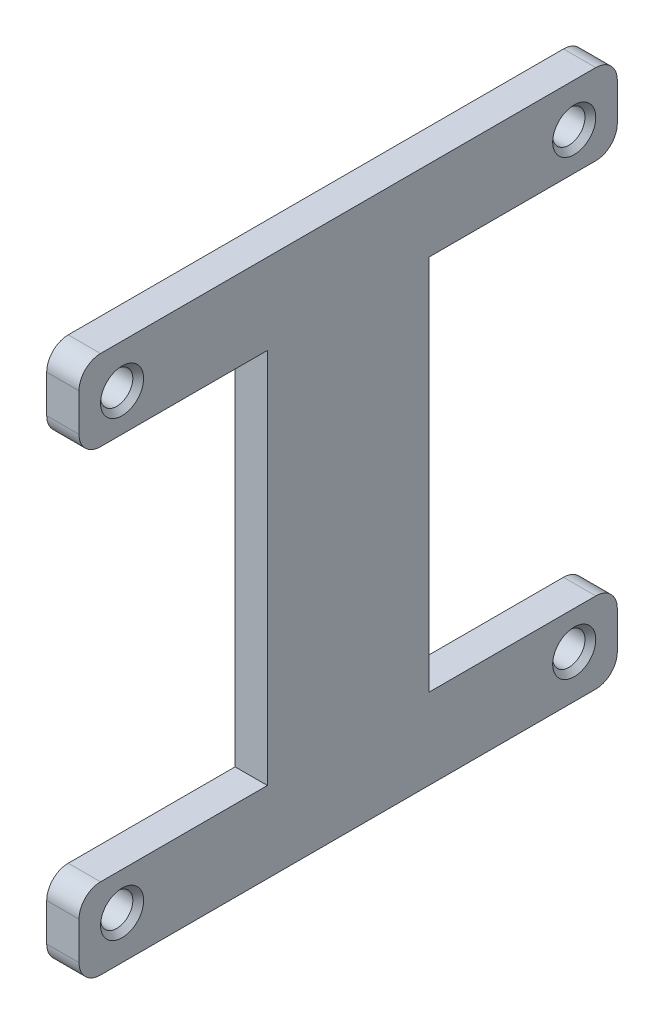
ISO-10303-21;
HEADER;
FILE_DESCRIPTION(('STEP AP214'),'2;1');
FILE_NAME('part.step','',(''),(''),'','','');
FILE_SCHEMA(('AUTOMOTIVE_DESIGN { 1 0 10303 214 1 1 1 1 }'));
ENDSEC;
DATA;
#1=APPLICATION_CONTEXT('core data for automotive mechanical design processes');
#2=APPLICATION_PROTOCOL_DEFINITION('international standard','automotive_design',2000,#1);
#3=PRODUCT_CONTEXT('',#1,'mechanical');
#4=PRODUCT('Part','Part','',(#3));
#5=PRODUCT_RELATED_PRODUCT_CATEGORY('part','',(#4));
#6=PRODUCT_DEFINITION_FORMATION('','',#4);
#7=PRODUCT_DEFINITION_CONTEXT('part definition',#1,'design');
#8=PRODUCT_DEFINITION('design','',#6,#7);
#9=PRODUCT_DEFINITION_SHAPE('','',#8);
#10=(LENGTH_UNIT() NAMED_UNIT(*) SI_UNIT(.MILLI.,.METRE.));
#11=(NAMED_UNIT(*) PLANE_ANGLE_UNIT() SI_UNIT($,.RADIAN.));
#12=(NAMED_UNIT(*) SI_UNIT($,.STERADIAN.) SOLID_ANGLE_UNIT());
#13=UNCERTAINTY_MEASURE_WITH_UNIT(LENGTH_MEASURE(1.E-05),#10,'distance_accuracy_value','');
#14=(GEOMETRIC_REPRESENTATION_CONTEXT(3) GLOBAL_UNCERTAINTY_ASSIGNED_CONTEXT((#13)) GLOBAL_UNIT_ASSIGNED_CONTEXT((#10,
#11,#12)) REPRESENTATION_CONTEXT('',''));
#15=CARTESIAN_POINT('',(0.,0.,0.));
#16=DIRECTION('',(0.,0.,1.));
#17=DIRECTION('',(1.,0.,0.));
#18=AXIS2_PLACEMENT_3D('',#15,#16,#17);
#19=CARTESIAN_POINT('',(3.,25.,25.));
#20=DIRECTION('',(0.,0.,-1.));
#21=DIRECTION('',(-1.,0.,0.));
#22=AXIS2_PLACEMENT_3D('',#19,#20,#21);
#23=PLANE('',#22);
#24=DIRECTION('',(0.,-1.,0.));
#25=VECTOR('',#24,1.);
#26=CARTESIAN_POINT('',(0.,25.,25.));
#27=LINE('',#26,#25);
#28=CARTESIAN_POINT('',(0.,23.,25.));
#29=VERTEX_POINT('',#28);
#30=CARTESIAN_POINT('',(0.,19.5,25.));
#31=VERTEX_POINT('',#30);
#32=EDGE_CURVE('E227',#29,#31,#27,.T.);
#33=ORIENTED_EDGE('',*,*,#32,.T.);
#34=DIRECTION('',(-1.,0.,0.));
#35=VECTOR('',#34,1.);
#36=CARTESIAN_POINT('',(3.,19.5,25.));
#37=LINE('',#36,#35);
#38=CARTESIAN_POINT('',(3.,19.5,25.));
#39=VERTEX_POINT('',#38);
#40=EDGE_CURVE('E11',#31,#39,#37,.F.);
#41=ORIENTED_EDGE('',*,*,#40,.T.);
#42=DIRECTION('',(0.,-1.,0.));
#43=VECTOR('',#42,1.);
#44=CARTESIAN_POINT('',(3.,25.,25.));
#45=LINE('',#44,#43);
#46=CARTESIAN_POINT('',(3.,23.,25.));
#47=VERTEX_POINT('',#46);
#48=EDGE_CURVE('E186',#47,#39,#45,.T.);
#49=ORIENTED_EDGE('',*,*,#48,.F.);
#50=DIRECTION('',(-1.,0.,0.));
#51=VECTOR('',#50,1.);
#52=CARTESIAN_POINT('',(3.,23.,25.));
#53=LINE('',#52,#51);
#54=EDGE_CURVE('E45',#47,#29,#53,.T.);
#55=ORIENTED_EDGE('',*,*,#54,.T.);
#56=EDGE_LOOP('',(#33,#41,#49,#55));
#57=FACE_BOUND('',#56,.T.);
#58=ADVANCED_FACE('F37',(#57),#23,.F.);
#59=CARTESIAN_POINT('',(3.,17.5,25.));
#60=DIRECTION('',(0.,1.,0.));
#61=DIRECTION('',(0.,0.,1.));
#62=AXIS2_PLACEMENT_3D('',#59,#60,#61);
#63=PLANE('',#62);
#64=DIRECTION('',(0.,0.,-1.));
#65=VECTOR('',#64,1.);
#66=CARTESIAN_POINT('',(3.,17.5,25.));
#67=LINE('',#66,#65);
#68=CARTESIAN_POINT('',(3.,17.5,23.));
#69=VERTEX_POINT('',#68);
#70=CARTESIAN_POINT('',(3.,17.5,7.49999999999999));
#71=VERTEX_POINT('',#70);
#72=EDGE_CURVE('E173',#69,#71,#67,.T.);
#73=ORIENTED_EDGE('',*,*,#72,.F.);
#74=DIRECTION('',(-1.,0.,0.));
#75=VECTOR('',#74,1.);
#76=CARTESIAN_POINT('',(3.,17.5,23.));
#77=LINE('',#76,#75);
#78=CARTESIAN_POINT('',(0.,17.5,23.));
#79=VERTEX_POINT('',#78);
#80=EDGE_CURVE('E348',#69,#79,#77,.T.);
#81=ORIENTED_EDGE('',*,*,#80,.T.);
#82=DIRECTION('',(0.,0.,-1.));
#83=VECTOR('',#82,1.);
#84=CARTESIAN_POINT('',(0.,17.5,25.));
#85=LINE('',#84,#83);
#86=CARTESIAN_POINT('',(0.,17.5,7.49999999999999));
#87=VERTEX_POINT('',#86);
#88=EDGE_CURVE('E192',#79,#87,#85,.T.);
#89=ORIENTED_EDGE('',*,*,#88,.T.);
#90=DIRECTION('',(-1.,0.,0.));
#91=VECTOR('',#90,1.);
#92=CARTESIAN_POINT('',(3.,17.5,7.49999999999999));
#93=LINE('',#92,#91);
#94=EDGE_CURVE('E189',#71,#87,#93,.T.);
#95=ORIENTED_EDGE('',*,*,#94,.F.);
#96=EDGE_LOOP('',(#73,#81,#89,#95));
#97=FACE_BOUND('',#96,.T.);
#98=ADVANCED_FACE('F190',(#97),#63,.F.);
#99=CARTESIAN_POINT('',(3.,17.5,7.49999999999999));
#100=DIRECTION('',(0.,0.,-1.));
#101=DIRECTION('',(0.,1.,0.));
#102=AXIS2_PLACEMENT_3D('',#99,#100,#101);
#103=PLANE('',#102);
#104=DIRECTION('',(0.,-1.,0.));
#105=VECTOR('',#104,1.);
#106=CARTESIAN_POINT('',(0.,17.5,7.49999999999999));
#107=LINE('',#106,#105);
#108=CARTESIAN_POINT('',(0.,-17.5,7.5));
#109=VERTEX_POINT('',#108);
#110=EDGE_CURVE('E232',#87,#109,#107,.T.);
#111=ORIENTED_EDGE('',*,*,#110,.T.);
#112=DIRECTION('',(-1.,0.,0.));
#113=VECTOR('',#112,1.);
#114=CARTESIAN_POINT('',(3.,-17.5,7.5));
#115=LINE('',#114,#113);
#116=CARTESIAN_POINT('',(3.,-17.5,7.5));
#117=VERTEX_POINT('',#116);
#118=EDGE_CURVE('E196',#117,#109,#115,.T.);
#119=ORIENTED_EDGE('',*,*,#118,.F.);
#120=DIRECTION('',(0.,-1.,0.));
#121=VECTOR('',#120,1.);
#122=CARTESIAN_POINT('',(3.,17.5,7.49999999999999));
#123=LINE('',#122,#121);
#124=EDGE_CURVE('E178',#71,#117,#123,.T.);
#125=ORIENTED_EDGE('',*,*,#124,.F.);
#126=ORIENTED_EDGE('',*,*,#94,.T.);
#127=EDGE_LOOP('',(#111,#119,#125,#126));
#128=FACE_BOUND('',#127,.T.);
#129=ADVANCED_FACE('F198',(#128),#103,.F.);
#130=CARTESIAN_POINT('',(3.,-17.5,25.));
#131=DIRECTION('',(0.,-1.,0.));
#132=DIRECTION('',(0.,0.,-1.));
#133=AXIS2_PLACEMENT_3D('',#130,#131,#132);
#134=PLANE('',#133);
#135=DIRECTION('',(0.,0.,1.));
#136=VECTOR('',#135,1.);
#137=CARTESIAN_POINT('',(0.,-17.5,25.));
#138=LINE('',#137,#136);
#139=CARTESIAN_POINT('',(0.,-17.5,23.));
#140=VERTEX_POINT('',#139);
#141=EDGE_CURVE('E234',#109,#140,#138,.T.);
#142=ORIENTED_EDGE('',*,*,#141,.T.);
#143=DIRECTION('',(-1.,0.,0.));
#144=VECTOR('',#143,1.);
#145=CARTESIAN_POINT('',(3.,-17.5,23.));
#146=LINE('',#145,#144);
#147=CARTESIAN_POINT('',(3.,-17.5,23.));
#148=VERTEX_POINT('',#147);
#149=EDGE_CURVE('E308',#140,#148,#146,.F.);
#150=ORIENTED_EDGE('',*,*,#149,.T.);
#151=DIRECTION('',(0.,0.,1.));
#152=VECTOR('',#151,1.);
#153=CARTESIAN_POINT('',(3.,-17.5,25.));
#154=LINE('',#153,#152);
#155=EDGE_CURVE('E201',#117,#148,#154,.T.);
#156=ORIENTED_EDGE('',*,*,#155,.F.);
#157=ORIENTED_EDGE('',*,*,#118,.T.);
#158=EDGE_LOOP('',(#142,#150,#156,#157));
#159=FACE_BOUND('',#158,.T.);
#160=ADVANCED_FACE('F590',(#159),#134,.F.);
#161=CARTESIAN_POINT('',(3.,-25.,25.));
#162=DIRECTION('',(0.,0.,-1.));
#163=DIRECTION('',(0.,1.,0.));
#164=AXIS2_PLACEMENT_3D('',#161,#162,#163);
#165=PLANE('',#164);
#166=DIRECTION('',(0.,-1.,0.));
#167=VECTOR('',#166,1.);
#168=CARTESIAN_POINT('',(3.,-25.,25.));
#169=LINE('',#168,#167);
#170=CARTESIAN_POINT('',(3.,-19.5,25.));
#171=VERTEX_POINT('',#170);
#172=CARTESIAN_POINT('',(3.,-23.,25.));
#173=VERTEX_POINT('',#172);
#174=EDGE_CURVE('E203',#171,#173,#169,.T.);
#175=ORIENTED_EDGE('',*,*,#174,.F.);
#176=DIRECTION('',(-1.,0.,0.));
#177=VECTOR('',#176,1.);
#178=CARTESIAN_POINT('',(3.,-19.5,25.));
#179=LINE('',#178,#177);
#180=CARTESIAN_POINT('',(0.,-19.5,25.));
#181=VERTEX_POINT('',#180);
#182=EDGE_CURVE('E289',#171,#181,#179,.T.);
#183=ORIENTED_EDGE('',*,*,#182,.T.);
#184=DIRECTION('',(0.,-1.,0.));
#185=VECTOR('',#184,1.);
#186=CARTESIAN_POINT('',(0.,-25.,25.));
#187=LINE('',#186,#185);
#188=CARTESIAN_POINT('',(0.,-23.,25.));
#189=VERTEX_POINT('',#188);
#190=EDGE_CURVE('E237',#181,#189,#187,.T.);
#191=ORIENTED_EDGE('',*,*,#190,.T.);
#192=DIRECTION('',(-1.,0.,0.));
#193=VECTOR('',#192,1.);
#194=CARTESIAN_POINT('',(3.,-23.,25.));
#195=LINE('',#194,#193);
#196=EDGE_CURVE('E287',#189,#173,#195,.F.);
#197=ORIENTED_EDGE('',*,*,#196,.T.);
#198=EDGE_LOOP('',(#175,#183,#191,#197));
#199=FACE_BOUND('',#198,.T.);
#200=ADVANCED_FACE('F580',(#199),#165,.F.);
#201=CARTESIAN_POINT('',(3.,-25.,-25.));
#202=DIRECTION('',(0.,1.,0.));
#203=DIRECTION('',(0.,0.,1.));
#204=AXIS2_PLACEMENT_3D('',#201,#202,#203);
#205=PLANE('',#204);
#206=DIRECTION('',(0.,0.,-1.));
#207=VECTOR('',#206,1.);
#208=CARTESIAN_POINT('',(3.,-25.,-25.));
#209=LINE('',#208,#207);
#210=CARTESIAN_POINT('',(3.,-25.,23.));
#211=VERTEX_POINT('',#210);
#212=CARTESIAN_POINT('',(3.,-25.,-23.));
#213=VERTEX_POINT('',#212);
#214=EDGE_CURVE('E209',#211,#213,#209,.T.);
#215=ORIENTED_EDGE('',*,*,#214,.F.);
#216=DIRECTION('',(-1.,0.,0.));
#217=VECTOR('',#216,1.);
#218=CARTESIAN_POINT('',(3.,-25.,23.));
#219=LINE('',#218,#217);
#220=CARTESIAN_POINT('',(0.,-25.,23.));
#221=VERTEX_POINT('',#220);
#222=EDGE_CURVE('E326',#211,#221,#219,.T.);
#223=ORIENTED_EDGE('',*,*,#222,.T.);
#224=DIRECTION('',(0.,0.,-1.));
#225=VECTOR('',#224,1.);
#226=CARTESIAN_POINT('',(0.,-25.,-25.));
#227=LINE('',#226,#225);
#228=CARTESIAN_POINT('',(0.,-25.,-23.));
#229=VERTEX_POINT('',#228);
#230=EDGE_CURVE('E240',#221,#229,#227,.T.);
#231=ORIENTED_EDGE('',*,*,#230,.T.);
#232=DIRECTION('',(-1.,0.,0.));
#233=VECTOR('',#232,1.);
#234=CARTESIAN_POINT('',(3.,-25.,-23.));
#235=LINE('',#234,#233);
#236=EDGE_CURVE('E324',#229,#213,#235,.F.);
#237=ORIENTED_EDGE('',*,*,#236,.T.);
#238=EDGE_LOOP('',(#215,#223,#231,#237));
#239=FACE_BOUND('',#238,.T.);
#240=ADVANCED_FACE('F570',(#239),#205,.F.);
#241=CARTESIAN_POINT('',(3.,-25.,-25.));
#242=DIRECTION('',(0.,0.,1.));
#243=DIRECTION('',(0.,-1.,0.));
#244=AXIS2_PLACEMENT_3D('',#241,#242,#243);
#245=PLANE('',#244);
#246=DIRECTION('',(0.,1.,0.));
#247=VECTOR('',#246,1.);
#248=CARTESIAN_POINT('',(3.,-25.,-25.));
#249=LINE('',#248,#247);
#250=CARTESIAN_POINT('',(3.,-23.,-25.));
#251=VERTEX_POINT('',#250);
#252=CARTESIAN_POINT('',(3.,-19.5,-25.));
#253=VERTEX_POINT('',#252);
#254=EDGE_CURVE('E212',#251,#253,#249,.T.);
#255=ORIENTED_EDGE('',*,*,#254,.F.);
#256=DIRECTION('',(-1.,0.,0.));
#257=VECTOR('',#256,1.);
#258=CARTESIAN_POINT('',(3.,-23.,-25.));
#259=LINE('',#258,#257);
#260=CARTESIAN_POINT('',(0.,-23.,-25.));
#261=VERTEX_POINT('',#260);
#262=EDGE_CURVE('E331',#251,#261,#259,.T.);
#263=ORIENTED_EDGE('',*,*,#262,.T.);
#264=DIRECTION('',(0.,1.,0.));
#265=VECTOR('',#264,1.);
#266=CARTESIAN_POINT('',(0.,-25.,-25.));
#267=LINE('',#266,#265);
#268=CARTESIAN_POINT('',(0.,-19.5,-25.));
#269=VERTEX_POINT('',#268);
#270=EDGE_CURVE('E243',#261,#269,#267,.T.);
#271=ORIENTED_EDGE('',*,*,#270,.T.);
#272=DIRECTION('',(-1.,0.,0.));
#273=VECTOR('',#272,1.);
#274=CARTESIAN_POINT('',(3.,-19.5,-25.));
#275=LINE('',#274,#273);
#276=EDGE_CURVE('E329',#269,#253,#275,.F.);
#277=ORIENTED_EDGE('',*,*,#276,.T.);
#278=EDGE_LOOP('',(#255,#263,#271,#277));
#279=FACE_BOUND('',#278,.T.);
#280=ADVANCED_FACE('F560',(#279),#245,.F.);
#281=CARTESIAN_POINT('',(3.,-17.5,-25.));
#282=DIRECTION('',(0.,-1.,0.));
#283=DIRECTION('',(0.,0.,-1.));
#284=AXIS2_PLACEMENT_3D('',#281,#282,#283);
#285=PLANE('',#284);
#286=DIRECTION('',(0.,0.,1.));
#287=VECTOR('',#286,1.);
#288=CARTESIAN_POINT('',(3.,-17.5,-25.));
#289=LINE('',#288,#287);
#290=CARTESIAN_POINT('',(3.,-17.5,-23.));
#291=VERTEX_POINT('',#290);
#292=CARTESIAN_POINT('',(3.,-17.5,-7.5));
#293=VERTEX_POINT('',#292);
#294=EDGE_CURVE('E215',#291,#293,#289,.T.);
#295=ORIENTED_EDGE('',*,*,#294,.F.);
#296=DIRECTION('',(-1.,0.,0.));
#297=VECTOR('',#296,1.);
#298=CARTESIAN_POINT('',(3.,-17.5,-23.));
#299=LINE('',#298,#297);
#300=CARTESIAN_POINT('',(0.,-17.5,-23.));
#301=VERTEX_POINT('',#300);
#302=EDGE_CURVE('E334',#291,#301,#299,.T.);
#303=ORIENTED_EDGE('',*,*,#302,.T.);
#304=DIRECTION('',(0.,0.,1.));
#305=VECTOR('',#304,1.);
#306=CARTESIAN_POINT('',(0.,-17.5,-25.));
#307=LINE('',#306,#305);
#308=CARTESIAN_POINT('',(0.,-17.5,-7.5));
#309=VERTEX_POINT('',#308);
#310=EDGE_CURVE('E246',#301,#309,#307,.T.);
#311=ORIENTED_EDGE('',*,*,#310,.T.);
#312=DIRECTION('',(-1.,0.,0.));
#313=VECTOR('',#312,1.);
#314=CARTESIAN_POINT('',(3.,-17.5,-7.5));
#315=LINE('',#314,#313);
#316=EDGE_CURVE('E260',#293,#309,#315,.T.);
#317=ORIENTED_EDGE('',*,*,#316,.F.);
#318=EDGE_LOOP('',(#295,#303,#311,#317));
#319=FACE_BOUND('',#318,.T.);
#320=ADVANCED_FACE('F555',(#319),#285,.F.);
#321=CARTESIAN_POINT('',(3.,17.5,-7.49999999999999));
#322=DIRECTION('',(0.,0.,1.));
#323=DIRECTION('',(0.,-1.,0.));
#324=AXIS2_PLACEMENT_3D('',#321,#322,#323);
#325=PLANE('',#324);
#326=DIRECTION('',(0.,1.,0.));
#327=VECTOR('',#326,1.);
#328=CARTESIAN_POINT('',(0.,17.5,-7.49999999999999));
#329=LINE('',#328,#327);
#330=CARTESIAN_POINT('',(0.,17.5,-7.49999999999999));
#331=VERTEX_POINT('',#330);
#332=EDGE_CURVE('E248',#309,#331,#329,.T.);
#333=ORIENTED_EDGE('',*,*,#332,.T.);
#334=DIRECTION('',(-1.,0.,0.));
#335=VECTOR('',#334,1.);
#336=CARTESIAN_POINT('',(3.,17.5,-7.49999999999999));
#337=LINE('',#336,#335);
#338=CARTESIAN_POINT('',(3.,17.5,-7.49999999999999));
#339=VERTEX_POINT('',#338);
#340=EDGE_CURVE('E226',#339,#331,#337,.T.);
#341=ORIENTED_EDGE('',*,*,#340,.F.);
#342=DIRECTION('',(0.,1.,0.));
#343=VECTOR('',#342,1.);
#344=CARTESIAN_POINT('',(3.,17.5,-7.49999999999999));
#345=LINE('',#344,#343);
#346=EDGE_CURVE('E217',#293,#339,#345,.T.);
#347=ORIENTED_EDGE('',*,*,#346,.F.);
#348=ORIENTED_EDGE('',*,*,#316,.T.);
#349=EDGE_LOOP('',(#333,#341,#347,#348));
#350=FACE_BOUND('',#349,.T.);
#351=ADVANCED_FACE('F547',(#350),#325,.F.);
#352=CARTESIAN_POINT('',(3.,17.5,-25.));
#353=DIRECTION('',(0.,1.,0.));
#354=DIRECTION('',(0.,0.,1.));
#355=AXIS2_PLACEMENT_3D('',#352,#353,#354);
#356=PLANE('',#355);
#357=DIRECTION('',(0.,0.,-1.));
#358=VECTOR('',#357,1.);
#359=CARTESIAN_POINT('',(0.,17.5,-25.));
#360=LINE('',#359,#358);
#361=CARTESIAN_POINT('',(0.,17.5,-23.));
#362=VERTEX_POINT('',#361);
#363=EDGE_CURVE('E250',#331,#362,#360,.T.);
#364=ORIENTED_EDGE('',*,*,#363,.T.);
#365=DIRECTION('',(-1.,0.,0.));
#366=VECTOR('',#365,1.);
#367=CARTESIAN_POINT('',(3.,17.5,-23.));
#368=LINE('',#367,#366);
#369=CARTESIAN_POINT('',(3.,17.5,-23.));
#370=VERTEX_POINT('',#369);
#371=EDGE_CURVE('E342',#362,#370,#368,.F.);
#372=ORIENTED_EDGE('',*,*,#371,.T.);
#373=DIRECTION('',(0.,0.,-1.));
#374=VECTOR('',#373,1.);
#375=CARTESIAN_POINT('',(3.,17.5,-25.));
#376=LINE('',#375,#374);
#377=EDGE_CURVE('E219',#339,#370,#376,.T.);
#378=ORIENTED_EDGE('',*,*,#377,.F.);
#379=ORIENTED_EDGE('',*,*,#340,.T.);
#380=EDGE_LOOP('',(#364,#372,#378,#379));
#381=FACE_BOUND('',#380,.T.);
#382=ADVANCED_FACE('F537',(#381),#356,.F.);
#383=CARTESIAN_POINT('',(3.,25.,-25.));
#384=DIRECTION('',(0.,0.,1.));
#385=DIRECTION('',(1.,0.,0.));
#386=AXIS2_PLACEMENT_3D('',#383,#384,#385);
#387=PLANE('',#386);
#388=DIRECTION('',(0.,1.,0.));
#389=VECTOR('',#388,1.);
#390=CARTESIAN_POINT('',(3.,25.,-25.));
#391=LINE('',#390,#389);
#392=CARTESIAN_POINT('',(3.,19.5,-25.));
#393=VERTEX_POINT('',#392);
#394=CARTESIAN_POINT('',(3.,23.,-25.));
#395=VERTEX_POINT('',#394);
#396=EDGE_CURVE('E222',#393,#395,#391,.T.);
#397=ORIENTED_EDGE('',*,*,#396,.F.);
#398=DIRECTION('',(-1.,0.,0.));
#399=VECTOR('',#398,1.);
#400=CARTESIAN_POINT('',(3.,19.5,-25.));
#401=LINE('',#400,#399);
#402=CARTESIAN_POINT('',(0.,19.5,-25.));
#403=VERTEX_POINT('',#402);
#404=EDGE_CURVE('E339',#393,#403,#401,.T.);
#405=ORIENTED_EDGE('',*,*,#404,.T.);
#406=DIRECTION('',(0.,1.,0.));
#407=VECTOR('',#406,1.);
#408=CARTESIAN_POINT('',(0.,25.,-25.));
#409=LINE('',#408,#407);
#410=CARTESIAN_POINT('',(0.,23.,-25.));
#411=VERTEX_POINT('',#410);
#412=EDGE_CURVE('E253',#403,#411,#409,.T.);
#413=ORIENTED_EDGE('',*,*,#412,.T.);
#414=DIRECTION('',(-1.,0.,0.));
#415=VECTOR('',#414,1.);
#416=CARTESIAN_POINT('',(3.,23.,-25.));
#417=LINE('',#416,#415);
#418=EDGE_CURVE('E337',#411,#395,#417,.F.);
#419=ORIENTED_EDGE('',*,*,#418,.T.);
#420=EDGE_LOOP('',(#397,#405,#413,#419));
#421=FACE_BOUND('',#420,.T.);
#422=ADVANCED_FACE('F528',(#421),#387,.F.);
#423=CARTESIAN_POINT('',(3.,25.,-25.));
#424=DIRECTION('',(0.,-1.,0.));
#425=DIRECTION('',(0.,0.,-1.));
#426=AXIS2_PLACEMENT_3D('',#423,#424,#425);
#427=PLANE('',#426);
#428=DIRECTION('',(0.,0.,1.));
#429=VECTOR('',#428,1.);
#430=CARTESIAN_POINT('',(3.,25.,-25.));
#431=LINE('',#430,#429);
#432=CARTESIAN_POINT('',(3.,25.,-23.));
#433=VERTEX_POINT('',#432);
#434=CARTESIAN_POINT('',(3.,25.,23.));
#435=VERTEX_POINT('',#434);
#436=EDGE_CURVE('E224',#433,#435,#431,.T.);
#437=ORIENTED_EDGE('',*,*,#436,.F.);
#438=DIRECTION('',(-1.,0.,0.));
#439=VECTOR('',#438,1.);
#440=CARTESIAN_POINT('',(3.,25.,-23.));
#441=LINE('',#440,#439);
#442=CARTESIAN_POINT('',(0.,25.,-23.));
#443=VERTEX_POINT('',#442);
#444=EDGE_CURVE('E345',#433,#443,#441,.T.);
#445=ORIENTED_EDGE('',*,*,#444,.T.);
#446=DIRECTION('',(0.,0.,1.));
#447=VECTOR('',#446,1.);
#448=CARTESIAN_POINT('',(0.,25.,-25.));
#449=LINE('',#448,#447);
#450=CARTESIAN_POINT('',(0.,25.,23.));
#451=VERTEX_POINT('',#450);
#452=EDGE_CURVE('E256',#443,#451,#449,.T.);
#453=ORIENTED_EDGE('',*,*,#452,.T.);
#454=DIRECTION('',(-1.,0.,0.));
#455=VECTOR('',#454,1.);
#456=CARTESIAN_POINT('',(3.,25.,23.));
#457=LINE('',#456,#455);
#458=EDGE_CURVE('E52',#451,#435,#457,.F.);
#459=ORIENTED_EDGE('',*,*,#458,.T.);
#460=EDGE_LOOP('',(#437,#445,#453,#459));
#461=FACE_BOUND('',#460,.T.);
#462=ADVANCED_FACE('F518',(#461),#427,.F.);
#463=CARTESIAN_POINT('',(3.,0.,0.));
#464=DIRECTION('',(1.,0.,0.));
#465=DIRECTION('',(0.,0.,-1.));
#466=AXIS2_PLACEMENT_3D('',#463,#464,#465);
#467=PLANE('',#466);
#468=CARTESIAN_POINT('',(3.,-21.,21.));
#469=DIRECTION('',(1.,0.,0.));
#470=DIRECTION('',(0.,0.,-1.));
#471=AXIS2_PLACEMENT_3D('',#468,#469,#470);
#472=CIRCLE('',#471,2.);
#473=CARTESIAN_POINT('',(3.,-21.,19.));
#474=VERTEX_POINT('',#473);
#475=EDGE_CURVE('E275',#474,#474,#472,.F.);
#476=ORIENTED_EDGE('',*,*,#475,.T.);
#477=EDGE_LOOP('',(#476));
#478=FACE_BOUND('',#477,.T.);
#479=CARTESIAN_POINT('',(3.,-21.,-21.));
#480=DIRECTION('',(1.,0.,0.));
#481=DIRECTION('',(0.,0.,-1.));
#482=AXIS2_PLACEMENT_3D('',#479,#480,#481);
#483=CIRCLE('',#482,2.);
#484=CARTESIAN_POINT('',(3.,-21.,-23.));
#485=VERTEX_POINT('',#484);
#486=EDGE_CURVE('E272',#485,#485,#483,.F.);
#487=ORIENTED_EDGE('',*,*,#486,.T.);
#488=EDGE_LOOP('',(#487));
#489=FACE_BOUND('',#488,.T.);
#490=CARTESIAN_POINT('',(3.,21.,-21.));
#491=DIRECTION('',(1.,0.,0.));
#492=DIRECTION('',(0.,0.,-1.));
#493=AXIS2_PLACEMENT_3D('',#490,#491,#492);
#494=CIRCLE('',#493,2.);
#495=CARTESIAN_POINT('',(3.,21.,-23.));
#496=VERTEX_POINT('',#495);
#497=EDGE_CURVE('E269',#496,#496,#494,.F.);
#498=ORIENTED_EDGE('',*,*,#497,.T.);
#499=EDGE_LOOP('',(#498));
#500=FACE_BOUND('',#499,.T.);
#501=CARTESIAN_POINT('',(3.,21.,21.));
#502=DIRECTION('',(1.,0.,0.));
#503=DIRECTION('',(0.,0.,-1.));
#504=AXIS2_PLACEMENT_3D('',#501,#502,#503);
#505=CIRCLE('',#504,2.);
#506=CARTESIAN_POINT('',(3.,21.,19.));
#507=VERTEX_POINT('',#506);
#508=EDGE_CURVE('E266',#507,#507,#505,.F.);
#509=ORIENTED_EDGE('',*,*,#508,.T.);
#510=EDGE_LOOP('',(#509));
#511=FACE_BOUND('',#510,.T.);
#512=ORIENTED_EDGE('',*,*,#155,.T.);
#513=CARTESIAN_POINT('',(3.,-19.5,23.));
#514=DIRECTION('',(1.,0.,0.));
#515=DIRECTION('',(0.,0.,-1.));
#516=AXIS2_PLACEMENT_3D('',#513,#514,#515);
#517=CIRCLE('',#516,2.);
#518=EDGE_CURVE('E322',#148,#171,#517,.T.);
#519=ORIENTED_EDGE('',*,*,#518,.T.);
#520=ORIENTED_EDGE('',*,*,#174,.T.);
#521=CARTESIAN_POINT('',(3.,-23.,23.));
#522=DIRECTION('',(1.,0.,0.));
#523=DIRECTION('',(0.,0.,-1.));
#524=AXIS2_PLACEMENT_3D('',#521,#522,#523);
#525=CIRCLE('',#524,2.);
#526=EDGE_CURVE('E320',#173,#211,#525,.T.);
#527=ORIENTED_EDGE('',*,*,#526,.T.);
#528=ORIENTED_EDGE('',*,*,#214,.T.);
#529=CARTESIAN_POINT('',(3.,-23.,-23.));
#530=DIRECTION('',(1.,0.,0.));
#531=DIRECTION('',(0.,0.,-1.));
#532=AXIS2_PLACEMENT_3D('',#529,#530,#531);
#533=CIRCLE('',#532,2.);
#534=EDGE_CURVE('E318',#213,#251,#533,.T.);
#535=ORIENTED_EDGE('',*,*,#534,.T.);
#536=ORIENTED_EDGE('',*,*,#254,.T.);
#537=CARTESIAN_POINT('',(3.,-19.5,-23.));
#538=DIRECTION('',(1.,0.,0.));
#539=DIRECTION('',(0.,0.,-1.));
#540=AXIS2_PLACEMENT_3D('',#537,#538,#539);
#541=CIRCLE('',#540,2.);
#542=EDGE_CURVE('E316',#253,#291,#541,.T.);
#543=ORIENTED_EDGE('',*,*,#542,.T.);
#544=ORIENTED_EDGE('',*,*,#294,.T.);
#545=ORIENTED_EDGE('',*,*,#346,.T.);
#546=ORIENTED_EDGE('',*,*,#377,.T.);
#547=CARTESIAN_POINT('',(3.,19.5,-23.));
#548=DIRECTION('',(1.,0.,0.));
#549=DIRECTION('',(0.,0.,-1.));
#550=AXIS2_PLACEMENT_3D('',#547,#548,#549);
#551=CIRCLE('',#550,2.);
#552=EDGE_CURVE('E314',#370,#393,#551,.T.);
#553=ORIENTED_EDGE('',*,*,#552,.T.);
#554=ORIENTED_EDGE('',*,*,#396,.T.);
#555=CARTESIAN_POINT('',(3.,23.,-23.));
#556=DIRECTION('',(1.,0.,0.));
#557=DIRECTION('',(0.,0.,-1.));
#558=AXIS2_PLACEMENT_3D('',#555,#556,#557);
#559=CIRCLE('',#558,2.);
#560=EDGE_CURVE('E59',#395,#433,#559,.T.);
#561=ORIENTED_EDGE('',*,*,#560,.T.);
#562=ORIENTED_EDGE('',*,*,#436,.T.);
#563=CARTESIAN_POINT('',(3.,23.,23.));
#564=DIRECTION('',(1.,0.,0.));
#565=DIRECTION('',(0.,0.,-1.));
#566=AXIS2_PLACEMENT_3D('',#563,#564,#565);
#567=CIRCLE('',#566,2.);
#568=EDGE_CURVE('E310',#435,#47,#567,.T.);
#569=ORIENTED_EDGE('',*,*,#568,.T.);
#570=ORIENTED_EDGE('',*,*,#48,.T.);
#571=CARTESIAN_POINT('',(3.,19.5,23.));
#572=DIRECTION('',(1.,0.,0.));
#573=DIRECTION('',(0.,0.,-1.));
#574=AXIS2_PLACEMENT_3D('',#571,#572,#573);
#575=CIRCLE('',#574,2.);
#576=EDGE_CURVE('E182',#39,#69,#575,.T.);
#577=ORIENTED_EDGE('',*,*,#576,.T.);
#578=ORIENTED_EDGE('',*,*,#72,.T.);
#579=ORIENTED_EDGE('',*,*,#124,.T.);
#580=EDGE_LOOP('',(#512,#519,#520,#527,#528,#535,#536,#543,#544,#545,#546,#553,#554,#561,#562,
#569,#570,#577,#578,#579));
#581=FACE_BOUND('',#580,.T.);
#582=ADVANCED_FACE('F176',(#478,#489,#500,#511,#581),#467,.T.);
#583=CARTESIAN_POINT('',(0.,0.,0.));
#584=DIRECTION('',(1.,0.,0.));
#585=DIRECTION('',(0.,0.,-1.));
#586=AXIS2_PLACEMENT_3D('',#583,#584,#585);
#587=PLANE('',#586);
#588=CARTESIAN_POINT('',(0.,21.,-21.));
#589=DIRECTION('',(1.,0.,0.));
#590=DIRECTION('',(0.,0.,1.));
#591=AXIS2_PLACEMENT_3D('',#588,#589,#590);
#592=CIRCLE('',#591,1.5);
#593=CARTESIAN_POINT('',(0.,21.,-19.5));
#594=VERTEX_POINT('',#593);
#595=EDGE_CURVE('E367',#594,#594,#592,.T.);
#596=ORIENTED_EDGE('',*,*,#595,.T.);
#597=EDGE_LOOP('',(#596));
#598=FACE_BOUND('',#597,.T.);
#599=CARTESIAN_POINT('',(0.,-21.,-21.));
#600=DIRECTION('',(1.,0.,0.));
#601=DIRECTION('',(0.,0.,1.));
#602=AXIS2_PLACEMENT_3D('',#599,#600,#601);
#603=CIRCLE('',#602,1.5);
#604=CARTESIAN_POINT('',(0.,-21.,-19.5));
#605=VERTEX_POINT('',#604);
#606=EDGE_CURVE('E370',#605,#605,#603,.T.);
#607=ORIENTED_EDGE('',*,*,#606,.T.);
#608=EDGE_LOOP('',(#607));
#609=FACE_BOUND('',#608,.T.);
#610=CARTESIAN_POINT('',(0.,-21.,21.));
#611=DIRECTION('',(1.,0.,0.));
#612=DIRECTION('',(0.,0.,-1.));
#613=AXIS2_PLACEMENT_3D('',#610,#611,#612);
#614=CIRCLE('',#613,1.5);
#615=CARTESIAN_POINT('',(0.,-21.,19.5));
#616=VERTEX_POINT('',#615);
#617=EDGE_CURVE('E366',#616,#616,#614,.T.);
#618=ORIENTED_EDGE('',*,*,#617,.T.);
#619=EDGE_LOOP('',(#618));
#620=FACE_BOUND('',#619,.T.);
#621=CARTESIAN_POINT('',(0.,21.,21.));
#622=DIRECTION('',(1.,0.,0.));
#623=DIRECTION('',(0.,0.,-1.));
#624=AXIS2_PLACEMENT_3D('',#621,#622,#623);
#625=CIRCLE('',#624,1.5);
#626=CARTESIAN_POINT('',(0.,21.,19.5));
#627=VERTEX_POINT('',#626);
#628=EDGE_CURVE('E230',#627,#627,#625,.T.);
#629=ORIENTED_EDGE('',*,*,#628,.T.);
#630=EDGE_LOOP('',(#629));
#631=FACE_BOUND('',#630,.T.);
#632=ORIENTED_EDGE('',*,*,#190,.F.);
#633=CARTESIAN_POINT('',(0.,-19.5,23.));
#634=DIRECTION('',(1.,0.,0.));
#635=DIRECTION('',(0.,0.,-1.));
#636=AXIS2_PLACEMENT_3D('',#633,#634,#635);
#637=CIRCLE('',#636,2.);
#638=EDGE_CURVE('E306',#181,#140,#637,.F.);
#639=ORIENTED_EDGE('',*,*,#638,.T.);
#640=ORIENTED_EDGE('',*,*,#141,.F.);
#641=ORIENTED_EDGE('',*,*,#110,.F.);
#642=ORIENTED_EDGE('',*,*,#88,.F.);
#643=CARTESIAN_POINT('',(0.,19.5,23.));
#644=DIRECTION('',(1.,0.,0.));
#645=DIRECTION('',(0.,0.,-1.));
#646=AXIS2_PLACEMENT_3D('',#643,#644,#645);
#647=CIRCLE('',#646,2.);
#648=EDGE_CURVE('E294',#79,#31,#647,.F.);
#649=ORIENTED_EDGE('',*,*,#648,.T.);
#650=ORIENTED_EDGE('',*,*,#32,.F.);
#651=CARTESIAN_POINT('',(0.,23.,23.));
#652=DIRECTION('',(1.,0.,0.));
#653=DIRECTION('',(0.,0.,-1.));
#654=AXIS2_PLACEMENT_3D('',#651,#652,#653);
#655=CIRCLE('',#654,2.);
#656=EDGE_CURVE('E292',#29,#451,#655,.F.);
#657=ORIENTED_EDGE('',*,*,#656,.T.);
#658=ORIENTED_EDGE('',*,*,#452,.F.);
#659=CARTESIAN_POINT('',(0.,23.,-23.));
#660=DIRECTION('',(1.,0.,0.));
#661=DIRECTION('',(0.,0.,-1.));
#662=AXIS2_PLACEMENT_3D('',#659,#660,#661);
#663=CIRCLE('',#662,2.);
#664=EDGE_CURVE('E296',#443,#411,#663,.F.);
#665=ORIENTED_EDGE('',*,*,#664,.T.);
#666=ORIENTED_EDGE('',*,*,#412,.F.);
#667=CARTESIAN_POINT('',(0.,19.5,-23.));
#668=DIRECTION('',(1.,0.,0.));
#669=DIRECTION('',(0.,0.,-1.));
#670=AXIS2_PLACEMENT_3D('',#667,#668,#669);
#671=CIRCLE('',#670,2.);
#672=EDGE_CURVE('E298',#403,#362,#671,.F.);
#673=ORIENTED_EDGE('',*,*,#672,.T.);
#674=ORIENTED_EDGE('',*,*,#363,.F.);
#675=ORIENTED_EDGE('',*,*,#332,.F.);
#676=ORIENTED_EDGE('',*,*,#310,.F.);
#677=CARTESIAN_POINT('',(0.,-19.5,-23.));
#678=DIRECTION('',(1.,0.,0.));
#679=DIRECTION('',(0.,0.,-1.));
#680=AXIS2_PLACEMENT_3D('',#677,#678,#679);
#681=CIRCLE('',#680,2.);
#682=EDGE_CURVE('E300',#301,#269,#681,.F.);
#683=ORIENTED_EDGE('',*,*,#682,.T.);
#684=ORIENTED_EDGE('',*,*,#270,.F.);
#685=CARTESIAN_POINT('',(0.,-23.,-23.));
#686=DIRECTION('',(1.,0.,0.));
#687=DIRECTION('',(0.,0.,-1.));
#688=AXIS2_PLACEMENT_3D('',#685,#686,#687);
#689=CIRCLE('',#688,2.);
#690=EDGE_CURVE('E302',#261,#229,#689,.F.);
#691=ORIENTED_EDGE('',*,*,#690,.T.);
#692=ORIENTED_EDGE('',*,*,#230,.F.);
#693=CARTESIAN_POINT('',(0.,-23.,23.));
#694=DIRECTION('',(1.,0.,0.));
#695=DIRECTION('',(0.,0.,-1.));
#696=AXIS2_PLACEMENT_3D('',#693,#694,#695);
#697=CIRCLE('',#696,2.);
#698=EDGE_CURVE('E304',#221,#189,#697,.F.);
#699=ORIENTED_EDGE('',*,*,#698,.T.);
#700=EDGE_LOOP('',(#632,#639,#640,#641,#642,#649,#650,#657,#658,#665,#666,#673,#674,#675,#676,
#683,#684,#691,#692,#699));
#701=FACE_BOUND('',#700,.T.);
#702=ADVANCED_FACE('F359',(#598,#609,#620,#631,#701),#587,.F.);
#703=CARTESIAN_POINT('',(0.,21.,21.));
#704=DIRECTION('',(1.,0.,0.));
#705=DIRECTION('',(0.,0.,-1.));
#706=AXIS2_PLACEMENT_3D('',#703,#704,#705);
#707=CYLINDRICAL_SURFACE('',#706,1.5);
#708=CARTESIAN_POINT('',(2.5,21.,21.));
#709=DIRECTION('',(1.,0.,0.));
#710=DIRECTION('',(0.,0.,-1.));
#711=AXIS2_PLACEMENT_3D('',#708,#709,#710);
#712=CIRCLE('',#711,1.5);
#713=CARTESIAN_POINT('',(2.5,21.,19.5));
#714=VERTEX_POINT('',#713);
#715=EDGE_CURVE('E284',#714,#714,#712,.T.);
#716=ORIENTED_EDGE('',*,*,#715,.T.);
#717=EDGE_LOOP('',(#716));
#718=FACE_BOUND('',#717,.T.);
#719=ORIENTED_EDGE('',*,*,#628,.F.);
#720=EDGE_LOOP('',(#719));
#721=FACE_BOUND('',#720,.T.);
#722=ADVANCED_FACE('F381',(#718,#721),#707,.F.);
#723=CARTESIAN_POINT('',(0.,-21.,21.));
#724=DIRECTION('',(1.,0.,0.));
#725=DIRECTION('',(0.,0.,-1.));
#726=AXIS2_PLACEMENT_3D('',#723,#724,#725);
#727=CYLINDRICAL_SURFACE('',#726,1.5);
#728=CARTESIAN_POINT('',(2.5,-21.,21.));
#729=DIRECTION('',(1.,0.,0.));
#730=DIRECTION('',(0.,0.,-1.));
#731=AXIS2_PLACEMENT_3D('',#728,#729,#730);
#732=CIRCLE('',#731,1.5);
#733=CARTESIAN_POINT('',(2.5,-21.,19.5));
#734=VERTEX_POINT('',#733);
#735=EDGE_CURVE('E195',#734,#734,#732,.T.);
#736=ORIENTED_EDGE('',*,*,#735,.T.);
#737=EDGE_LOOP('',(#736));
#738=FACE_BOUND('',#737,.T.);
#739=ORIENTED_EDGE('',*,*,#617,.F.);
#740=EDGE_LOOP('',(#739));
#741=FACE_BOUND('',#740,.T.);
#742=ADVANCED_FACE('F378',(#738,#741),#727,.F.);
#743=CARTESIAN_POINT('',(0.,-21.,-21.));
#744=DIRECTION('',(1.,0.,0.));
#745=DIRECTION('',(0.,0.,-1.));
#746=AXIS2_PLACEMENT_3D('',#743,#744,#745);
#747=CYLINDRICAL_SURFACE('',#746,1.5);
#748=CARTESIAN_POINT('',(2.5,-21.,-21.));
#749=DIRECTION('',(1.,0.,0.));
#750=DIRECTION('',(0.,0.,-1.));
#751=AXIS2_PLACEMENT_3D('',#748,#749,#750);
#752=CIRCLE('',#751,1.5);
#753=CARTESIAN_POINT('',(2.5,-21.,-22.5));
#754=VERTEX_POINT('',#753);
#755=EDGE_CURVE('E278',#754,#754,#752,.T.);
#756=ORIENTED_EDGE('',*,*,#755,.T.);
#757=EDGE_LOOP('',(#756));
#758=FACE_BOUND('',#757,.T.);
#759=ORIENTED_EDGE('',*,*,#606,.F.);
#760=EDGE_LOOP('',(#759));
#761=FACE_BOUND('',#760,.T.);
#762=ADVANCED_FACE('F380',(#758,#761),#747,.F.);
#763=CARTESIAN_POINT('',(0.,21.,-21.));
#764=DIRECTION('',(1.,0.,0.));
#765=DIRECTION('',(0.,0.,-1.));
#766=AXIS2_PLACEMENT_3D('',#763,#764,#765);
#767=CYLINDRICAL_SURFACE('',#766,1.5);
#768=CARTESIAN_POINT('',(2.5,21.,-21.));
#769=DIRECTION('',(1.,0.,0.));
#770=DIRECTION('',(0.,0.,-1.));
#771=AXIS2_PLACEMENT_3D('',#768,#769,#770);
#772=CIRCLE('',#771,1.5);
#773=CARTESIAN_POINT('',(2.5,21.,-22.5));
#774=VERTEX_POINT('',#773);
#775=EDGE_CURVE('E281',#774,#774,#772,.T.);
#776=ORIENTED_EDGE('',*,*,#775,.T.);
#777=EDGE_LOOP('',(#776));
#778=FACE_BOUND('',#777,.T.);
#779=ORIENTED_EDGE('',*,*,#595,.F.);
#780=EDGE_LOOP('',(#779));
#781=FACE_BOUND('',#780,.T.);
#782=ADVANCED_FACE('F388',(#778,#781),#767,.F.);
#783=CARTESIAN_POINT('',(2.5,-21.,21.));
#784=DIRECTION('',(1.,0.,0.));
#785=DIRECTION('',(0.,0.,-1.));
#786=AXIS2_PLACEMENT_3D('',#783,#784,#785);
#787=CONICAL_SURFACE('',#786,1.5,0.78539816339745);
#788=ORIENTED_EDGE('',*,*,#475,.F.);
#789=EDGE_LOOP('',(#788));
#790=FACE_BOUND('',#789,.T.);
#791=ORIENTED_EDGE('',*,*,#735,.F.);
#792=EDGE_LOOP('',(#791));
#793=FACE_BOUND('',#792,.T.);
#794=ADVANCED_FACE('F402',(#790,#793),#787,.F.);
#795=CARTESIAN_POINT('',(2.5,-21.,-21.));
#796=DIRECTION('',(1.,0.,0.));
#797=DIRECTION('',(0.,0.,-1.));
#798=AXIS2_PLACEMENT_3D('',#795,#796,#797);
#799=CONICAL_SURFACE('',#798,1.5,0.78539816339745);
#800=ORIENTED_EDGE('',*,*,#486,.F.);
#801=EDGE_LOOP('',(#800));
#802=FACE_BOUND('',#801,.T.);
#803=ORIENTED_EDGE('',*,*,#755,.F.);
#804=EDGE_LOOP('',(#803));
#805=FACE_BOUND('',#804,.T.);
#806=ADVANCED_FACE('F408',(#802,#805),#799,.F.);
#807=CARTESIAN_POINT('',(2.5,21.,-21.));
#808=DIRECTION('',(1.,0.,0.));
#809=DIRECTION('',(0.,0.,-1.));
#810=AXIS2_PLACEMENT_3D('',#807,#808,#809);
#811=CONICAL_SURFACE('',#810,1.5,0.78539816339745);
#812=ORIENTED_EDGE('',*,*,#497,.F.);
#813=EDGE_LOOP('',(#812));
#814=FACE_BOUND('',#813,.T.);
#815=ORIENTED_EDGE('',*,*,#775,.F.);
#816=EDGE_LOOP('',(#815));
#817=FACE_BOUND('',#816,.T.);
#818=ADVANCED_FACE('F415',(#814,#817),#811,.F.);
#819=CARTESIAN_POINT('',(2.5,21.,21.));
#820=DIRECTION('',(1.,0.,0.));
#821=DIRECTION('',(0.,0.,-1.));
#822=AXIS2_PLACEMENT_3D('',#819,#820,#821);
#823=CONICAL_SURFACE('',#822,1.5,0.78539816339745);
#824=ORIENTED_EDGE('',*,*,#508,.F.);
#825=EDGE_LOOP('',(#824));
#826=FACE_BOUND('',#825,.T.);
#827=ORIENTED_EDGE('',*,*,#715,.F.);
#828=EDGE_LOOP('',(#827));
#829=FACE_BOUND('',#828,.T.);
#830=ADVANCED_FACE('F422',(#826,#829),#823,.F.);
#831=CARTESIAN_POINT('',(3.,-19.5,23.));
#832=DIRECTION('',(-1.,0.,0.));
#833=DIRECTION('',(0.,0.,1.));
#834=AXIS2_PLACEMENT_3D('',#831,#832,#833);
#835=CYLINDRICAL_SURFACE('',#834,2.);
#836=ORIENTED_EDGE('',*,*,#518,.F.);
#837=ORIENTED_EDGE('',*,*,#149,.F.);
#838=ORIENTED_EDGE('',*,*,#638,.F.);
#839=ORIENTED_EDGE('',*,*,#182,.F.);
#840=EDGE_LOOP('',(#836,#837,#838,#839));
#841=FACE_BOUND('',#840,.T.);
#842=ADVANCED_FACE('F428',(#841),#835,.T.);
#843=CARTESIAN_POINT('',(3.,-23.,23.));
#844=DIRECTION('',(-1.,0.,0.));
#845=DIRECTION('',(0.,0.,1.));
#846=AXIS2_PLACEMENT_3D('',#843,#844,#845);
#847=CYLINDRICAL_SURFACE('',#846,2.);
#848=ORIENTED_EDGE('',*,*,#526,.F.);
#849=ORIENTED_EDGE('',*,*,#196,.F.);
#850=ORIENTED_EDGE('',*,*,#698,.F.);
#851=ORIENTED_EDGE('',*,*,#222,.F.);
#852=EDGE_LOOP('',(#848,#849,#850,#851));
#853=FACE_BOUND('',#852,.T.);
#854=ADVANCED_FACE('F432',(#853),#847,.T.);
#855=CARTESIAN_POINT('',(3.,-23.,-23.));
#856=DIRECTION('',(-1.,0.,0.));
#857=DIRECTION('',(0.,0.,1.));
#858=AXIS2_PLACEMENT_3D('',#855,#856,#857);
#859=CYLINDRICAL_SURFACE('',#858,2.);
#860=ORIENTED_EDGE('',*,*,#534,.F.);
#861=ORIENTED_EDGE('',*,*,#236,.F.);
#862=ORIENTED_EDGE('',*,*,#690,.F.);
#863=ORIENTED_EDGE('',*,*,#262,.F.);
#864=EDGE_LOOP('',(#860,#861,#862,#863));
#865=FACE_BOUND('',#864,.T.);
#866=ADVANCED_FACE('F436',(#865),#859,.T.);
#867=CARTESIAN_POINT('',(3.,-19.5,-23.));
#868=DIRECTION('',(-1.,0.,0.));
#869=DIRECTION('',(0.,0.,1.));
#870=AXIS2_PLACEMENT_3D('',#867,#868,#869);
#871=CYLINDRICAL_SURFACE('',#870,2.);
#872=ORIENTED_EDGE('',*,*,#542,.F.);
#873=ORIENTED_EDGE('',*,*,#276,.F.);
#874=ORIENTED_EDGE('',*,*,#682,.F.);
#875=ORIENTED_EDGE('',*,*,#302,.F.);
#876=EDGE_LOOP('',(#872,#873,#874,#875));
#877=FACE_BOUND('',#876,.T.);
#878=ADVANCED_FACE('F440',(#877),#871,.T.);
#879=CARTESIAN_POINT('',(3.,19.5,-23.));
#880=DIRECTION('',(-1.,0.,0.));
#881=DIRECTION('',(0.,0.,1.));
#882=AXIS2_PLACEMENT_3D('',#879,#880,#881);
#883=CYLINDRICAL_SURFACE('',#882,2.);
#884=ORIENTED_EDGE('',*,*,#552,.F.);
#885=ORIENTED_EDGE('',*,*,#371,.F.);
#886=ORIENTED_EDGE('',*,*,#672,.F.);
#887=ORIENTED_EDGE('',*,*,#404,.F.);
#888=EDGE_LOOP('',(#884,#885,#886,#887));
#889=FACE_BOUND('',#888,.T.);
#890=ADVANCED_FACE('F444',(#889),#883,.T.);
#891=CARTESIAN_POINT('',(3.,23.,-23.));
#892=DIRECTION('',(-1.,0.,0.));
#893=DIRECTION('',(0.,0.,1.));
#894=AXIS2_PLACEMENT_3D('',#891,#892,#893);
#895=CYLINDRICAL_SURFACE('',#894,2.);
#896=ORIENTED_EDGE('',*,*,#560,.F.);
#897=ORIENTED_EDGE('',*,*,#418,.F.);
#898=ORIENTED_EDGE('',*,*,#664,.F.);
#899=ORIENTED_EDGE('',*,*,#444,.F.);
#900=EDGE_LOOP('',(#896,#897,#898,#899));
#901=FACE_BOUND('',#900,.T.);
#902=ADVANCED_FACE('F448',(#901),#895,.T.);
#903=CARTESIAN_POINT('',(3.,19.5,23.));
#904=DIRECTION('',(-1.,0.,0.));
#905=DIRECTION('',(0.,0.,1.));
#906=AXIS2_PLACEMENT_3D('',#903,#904,#905);
#907=CYLINDRICAL_SURFACE('',#906,2.);
#908=ORIENTED_EDGE('',*,*,#576,.F.);
#909=ORIENTED_EDGE('',*,*,#40,.F.);
#910=ORIENTED_EDGE('',*,*,#648,.F.);
#911=ORIENTED_EDGE('',*,*,#80,.F.);
#912=EDGE_LOOP('',(#908,#909,#910,#911));
#913=FACE_BOUND('',#912,.T.);
#914=ADVANCED_FACE('F362',(#913),#907,.T.);
#915=CARTESIAN_POINT('',(3.,23.,23.));
#916=DIRECTION('',(-1.,0.,0.));
#917=DIRECTION('',(0.,0.,1.));
#918=AXIS2_PLACEMENT_3D('',#915,#916,#917);
#919=CYLINDRICAL_SURFACE('',#918,2.);
#920=ORIENTED_EDGE('',*,*,#568,.F.);
#921=ORIENTED_EDGE('',*,*,#458,.F.);
#922=ORIENTED_EDGE('',*,*,#656,.F.);
#923=ORIENTED_EDGE('',*,*,#54,.F.);
#924=EDGE_LOOP('',(#920,#921,#922,#923));
#925=FACE_BOUND('',#924,.T.);
#926=ADVANCED_FACE('F39',(#925),#919,.T.);
#927=CLOSED_SHELL('',(#58,#98,#129,#160,#200,#240,#280,#320,#351,#382,#422,#462,#582,#702,#722,
#742,#762,#782,#794,#806,#818,#830,#842,#854,#866,#878,#890,#902,#914,#926));
#928=MANIFOLD_SOLID_BREP('B2',#927);
#929=ADVANCED_BREP_SHAPE_REPRESENTATION('',(#18,#928),#14);
#930=SHAPE_DEFINITION_REPRESENTATION(#9,#929);
ENDSEC;
END-ISO-10303-21;
